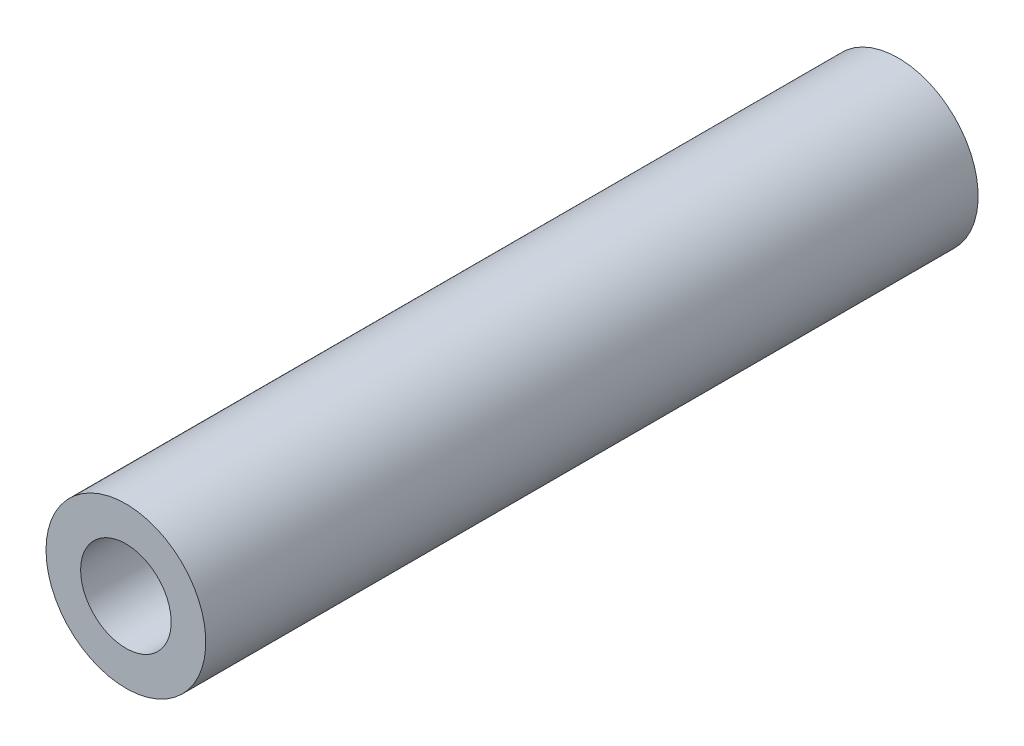
ISO-10303-21;
HEADER;
FILE_DESCRIPTION(('STEP AP214'),'2;1');
FILE_NAME('part.step','',(''),(''),'','','');
FILE_SCHEMA(('AUTOMOTIVE_DESIGN { 1 0 10303 214 1 1 1 1 }'));
ENDSEC;
DATA;
#1=APPLICATION_CONTEXT('core data for automotive mechanical design processes');
#2=APPLICATION_PROTOCOL_DEFINITION('international standard','automotive_design',2000,#1);
#3=PRODUCT_CONTEXT('',#1,'mechanical');
#4=PRODUCT('Part','Part','',(#3));
#5=PRODUCT_RELATED_PRODUCT_CATEGORY('part','',(#4));
#6=PRODUCT_DEFINITION_FORMATION('','',#4);
#7=PRODUCT_DEFINITION_CONTEXT('part definition',#1,'design');
#8=PRODUCT_DEFINITION('design','',#6,#7);
#9=PRODUCT_DEFINITION_SHAPE('','',#8);
#10=(LENGTH_UNIT() NAMED_UNIT(*) SI_UNIT(.MILLI.,.METRE.));
#11=(NAMED_UNIT(*) PLANE_ANGLE_UNIT() SI_UNIT($,.RADIAN.));
#12=(NAMED_UNIT(*) SI_UNIT($,.STERADIAN.) SOLID_ANGLE_UNIT());
#13=UNCERTAINTY_MEASURE_WITH_UNIT(LENGTH_MEASURE(1.E-05),#10,'distance_accuracy_value','');
#14=(GEOMETRIC_REPRESENTATION_CONTEXT(3) GLOBAL_UNCERTAINTY_ASSIGNED_CONTEXT((#13)) GLOBAL_UNIT_ASSIGNED_CONTEXT((#10,
#11,#12)) REPRESENTATION_CONTEXT('',''));
#15=CARTESIAN_POINT('',(0.,0.,0.));
#16=DIRECTION('',(0.,0.,1.));
#17=DIRECTION('',(1.,0.,0.));
#18=AXIS2_PLACEMENT_3D('',#15,#16,#17);
#19=CARTESIAN_POINT('',(0.,0.,29.));
#20=DIRECTION('',(0.,0.,1.));
#21=DIRECTION('',(1.,0.,0.));
#22=AXIS2_PLACEMENT_3D('',#19,#20,#21);
#23=PLANE('',#22);
#24=CARTESIAN_POINT('',(0.,0.,29.));
#25=DIRECTION('',(0.,0.,1.));
#26=DIRECTION('',(1.,0.,0.));
#27=AXIS2_PLACEMENT_3D('',#24,#25,#26);
#28=CIRCLE('',#27,3.);
#29=CARTESIAN_POINT('',(-3.,0.,29.));
#30=VERTEX_POINT('',#29);
#31=EDGE_CURVE('E10',#30,#30,#28,.T.);
#32=ORIENTED_EDGE('',*,*,#31,.T.);
#33=EDGE_LOOP('',(#32));
#34=FACE_BOUND('',#33,.T.);
#35=CARTESIAN_POINT('',(0.,0.,29.));
#36=DIRECTION('',(0.,0.,1.));
#37=DIRECTION('',(1.,0.,0.));
#38=AXIS2_PLACEMENT_3D('',#35,#36,#37);
#39=CIRCLE('',#38,1.7);
#40=CARTESIAN_POINT('',(-1.7,0.,29.));
#41=VERTEX_POINT('',#40);
#42=EDGE_CURVE('E48',#41,#41,#39,.T.);
#43=ORIENTED_EDGE('',*,*,#42,.F.);
#44=EDGE_LOOP('',(#43));
#45=FACE_BOUND('',#44,.T.);
#46=ADVANCED_FACE('F40',(#34,#45),#23,.T.);
#47=CARTESIAN_POINT('',(0.,0.,0.));
#48=DIRECTION('',(0.,0.,1.));
#49=DIRECTION('',(1.,0.,0.));
#50=AXIS2_PLACEMENT_3D('',#47,#48,#49);
#51=PLANE('',#50);
#52=CARTESIAN_POINT('',(0.,0.,0.));
#53=DIRECTION('',(0.,0.,1.));
#54=DIRECTION('',(1.,0.,0.));
#55=AXIS2_PLACEMENT_3D('',#52,#53,#54);
#56=CIRCLE('',#55,3.);
#57=CARTESIAN_POINT('',(-3.,0.,0.));
#58=VERTEX_POINT('',#57);
#59=EDGE_CURVE('E41',#58,#58,#56,.T.);
#60=ORIENTED_EDGE('',*,*,#59,.F.);
#61=EDGE_LOOP('',(#60));
#62=FACE_BOUND('',#61,.T.);
#63=CARTESIAN_POINT('',(0.,0.,0.));
#64=DIRECTION('',(0.,0.,1.));
#65=DIRECTION('',(1.,0.,0.));
#66=AXIS2_PLACEMENT_3D('',#63,#64,#65);
#67=CIRCLE('',#66,1.7);
#68=CARTESIAN_POINT('',(-1.7,0.,0.));
#69=VERTEX_POINT('',#68);
#70=EDGE_CURVE('E49',#69,#69,#67,.T.);
#71=ORIENTED_EDGE('',*,*,#70,.T.);
#72=EDGE_LOOP('',(#71));
#73=FACE_BOUND('',#72,.T.);
#74=ADVANCED_FACE('F58',(#62,#73),#51,.F.);
#75=CARTESIAN_POINT('',(0.,0.,29.));
#76=DIRECTION('',(0.,0.,-1.));
#77=DIRECTION('',(-1.,0.,0.));
#78=AXIS2_PLACEMENT_3D('',#75,#76,#77);
#79=CYLINDRICAL_SURFACE('',#78,3.);
#80=CARTESIAN_POINT('',(-3.,0.,29.));
#81=CARTESIAN_POINT('',(-3.,0.,28.6979166666667));
#82=CARTESIAN_POINT('',(-3.,0.,28.3958333333333));
#83=CARTESIAN_POINT('',(-3.,0.,27.7916666666667));
#84=CARTESIAN_POINT('',(-3.,0.,27.4895833333333));
#85=CARTESIAN_POINT('',(-3.,0.,26.8854166666667));
#86=CARTESIAN_POINT('',(-3.,0.,26.5833333333333));
#87=CARTESIAN_POINT('',(-3.,0.,25.9791666666667));
#88=CARTESIAN_POINT('',(-3.,0.,25.6770833333333));
#89=CARTESIAN_POINT('',(-3.,0.,25.0729166666667));
#90=CARTESIAN_POINT('',(-3.,0.,24.7708333333333));
#91=CARTESIAN_POINT('',(-3.,0.,24.1666666666667));
#92=CARTESIAN_POINT('',(-3.,0.,23.8645833333333));
#93=CARTESIAN_POINT('',(-3.,0.,23.2604166666667));
#94=CARTESIAN_POINT('',(-3.,0.,22.9583333333333));
#95=CARTESIAN_POINT('',(-3.,0.,22.3541666666667));
#96=CARTESIAN_POINT('',(-3.,0.,22.0520833333333));
#97=CARTESIAN_POINT('',(-3.,0.,21.4479166666667));
#98=CARTESIAN_POINT('',(-3.,0.,21.1458333333333));
#99=CARTESIAN_POINT('',(-3.,0.,20.5416666666667));
#100=CARTESIAN_POINT('',(-3.,0.,20.2395833333333));
#101=CARTESIAN_POINT('',(-3.,0.,19.6354166666667));
#102=CARTESIAN_POINT('',(-3.,0.,19.3333333333333));
#103=CARTESIAN_POINT('',(-3.,0.,18.7291666666667));
#104=CARTESIAN_POINT('',(-3.,0.,18.4270833333333));
#105=CARTESIAN_POINT('',(-3.,0.,17.8229166666667));
#106=CARTESIAN_POINT('',(-3.,0.,17.5208333333333));
#107=CARTESIAN_POINT('',(-3.,0.,16.9166666666667));
#108=CARTESIAN_POINT('',(-3.,0.,16.6145833333333));
#109=CARTESIAN_POINT('',(-3.,0.,16.0104166666667));
#110=CARTESIAN_POINT('',(-3.,0.,15.7083333333333));
#111=CARTESIAN_POINT('',(-3.,0.,15.1041666666667));
#112=CARTESIAN_POINT('',(-3.,0.,14.8020833333333));
#113=CARTESIAN_POINT('',(-3.,0.,14.1979166666667));
#114=CARTESIAN_POINT('',(-3.,0.,13.8958333333333));
#115=CARTESIAN_POINT('',(-3.,0.,13.2916666666667));
#116=CARTESIAN_POINT('',(-3.,0.,12.9895833333333));
#117=CARTESIAN_POINT('',(-3.,0.,12.3854166666667));
#118=CARTESIAN_POINT('',(-3.,0.,12.0833333333333));
#119=CARTESIAN_POINT('',(-3.,0.,11.4791666666667));
#120=CARTESIAN_POINT('',(-3.,0.,11.1770833333333));
#121=CARTESIAN_POINT('',(-3.,0.,10.5729166666667));
#122=CARTESIAN_POINT('',(-3.,0.,10.2708333333333));
#123=CARTESIAN_POINT('',(-3.,0.,9.66666666666667));
#124=CARTESIAN_POINT('',(-3.,0.,9.36458333333333));
#125=CARTESIAN_POINT('',(-3.,0.,8.76041666666667));
#126=CARTESIAN_POINT('',(-3.,0.,8.45833333333333));
#127=CARTESIAN_POINT('',(-3.,0.,7.85416666666667));
#128=CARTESIAN_POINT('',(-3.,0.,7.55208333333333));
#129=CARTESIAN_POINT('',(-3.,0.,6.94791666666667));
#130=CARTESIAN_POINT('',(-3.,0.,6.64583333333333));
#131=CARTESIAN_POINT('',(-3.,0.,6.04166666666667));
#132=CARTESIAN_POINT('',(-3.,0.,5.73958333333333));
#133=CARTESIAN_POINT('',(-3.,0.,5.13541666666667));
#134=CARTESIAN_POINT('',(-3.,0.,4.83333333333333));
#135=CARTESIAN_POINT('',(-3.,0.,4.22916666666667));
#136=CARTESIAN_POINT('',(-3.,0.,3.92708333333333));
#137=CARTESIAN_POINT('',(-3.,0.,3.32291666666667));
#138=CARTESIAN_POINT('',(-3.,0.,3.02083333333333));
#139=CARTESIAN_POINT('',(-3.,0.,2.41666666666667));
#140=CARTESIAN_POINT('',(-3.,0.,2.11458333333333));
#141=CARTESIAN_POINT('',(-3.,0.,1.51041666666667));
#142=CARTESIAN_POINT('',(-3.,0.,1.20833333333333));
#143=CARTESIAN_POINT('',(-3.,0.,0.604166666666667));
#144=CARTESIAN_POINT('',(-3.,0.,0.302083333333333));
#145=CARTESIAN_POINT('',(-3.,0.,0.));
#146=B_SPLINE_CURVE_WITH_KNOTS('',3,(#80,#81,#82,#83,#84,#85,#86,#87,#88,#89,#90,#91,#92,#93,
#94,#95,#96,#97,#98,#99,#100,#101,#102,#103,#104,#105,#106,#107,#108,#109,#110,#111,#112,#113,
#114,#115,#116,#117,#118,#119,#120,#121,#122,#123,#124,#125,#126,#127,#128,#129,#130,#131,#132,
#133,#134,#135,#136,#137,#138,#139,#140,#141,#142,#143,#144,#145),.UNSPECIFIED.,.F.,.F.,(4,2,2,
2,2,2,2,2,2,2,2,2,2,2,2,2,2,2,2,2,2,2,2,2,2,2,2,2,2,2,2,2,4),(0.,0.906249999999997,1.8125,
2.71875,3.625,4.53125,5.4375,6.34375,7.25,8.15625,9.0625,9.96875,10.875,11.78125,12.6875,
13.59375,14.5,15.40625,16.3125,17.21875,18.125,19.03125,19.9375,20.84375,21.75,22.65625,23.5625,
24.46875,25.375,26.28125,27.1875,28.09375,29.),.UNSPECIFIED.);
#147=EDGE_CURVE('BSEAM39',#30,#58,#146,.T.);
#148=ORIENTED_EDGE('',*,*,#31,.F.);
#149=ORIENTED_EDGE('',*,*,#59,.T.);
#150=ORIENTED_EDGE('',*,*,#147,.T.);
#151=ORIENTED_EDGE('',*,*,#147,.F.);
#152=EDGE_LOOP('',(#148,#150,#149,#151));
#153=FACE_BOUND('',#152,.T.);
#154=ADVANCED_FACE('F39',(#153),#79,.T.);
#155=CARTESIAN_POINT('',(0.,0.,29.));
#156=DIRECTION('',(0.,0.,-1.));
#157=DIRECTION('',(-1.,0.,0.));
#158=AXIS2_PLACEMENT_3D('',#155,#156,#157);
#159=CYLINDRICAL_SURFACE('',#158,1.7);
#160=CARTESIAN_POINT('',(-1.7,0.,29.));
#161=CARTESIAN_POINT('',(-1.7,0.,28.6979166666667));
#162=CARTESIAN_POINT('',(-1.7,0.,28.3958333333333));
#163=CARTESIAN_POINT('',(-1.7,0.,27.7916666666667));
#164=CARTESIAN_POINT('',(-1.7,0.,27.4895833333333));
#165=CARTESIAN_POINT('',(-1.7,0.,26.8854166666667));
#166=CARTESIAN_POINT('',(-1.7,0.,26.5833333333333));
#167=CARTESIAN_POINT('',(-1.7,0.,25.9791666666667));
#168=CARTESIAN_POINT('',(-1.7,0.,25.6770833333333));
#169=CARTESIAN_POINT('',(-1.7,0.,25.0729166666667));
#170=CARTESIAN_POINT('',(-1.7,0.,24.7708333333333));
#171=CARTESIAN_POINT('',(-1.7,0.,24.1666666666667));
#172=CARTESIAN_POINT('',(-1.7,0.,23.8645833333333));
#173=CARTESIAN_POINT('',(-1.7,0.,23.2604166666667));
#174=CARTESIAN_POINT('',(-1.7,0.,22.9583333333333));
#175=CARTESIAN_POINT('',(-1.7,0.,22.3541666666667));
#176=CARTESIAN_POINT('',(-1.7,0.,22.0520833333333));
#177=CARTESIAN_POINT('',(-1.7,0.,21.4479166666667));
#178=CARTESIAN_POINT('',(-1.7,0.,21.1458333333333));
#179=CARTESIAN_POINT('',(-1.7,0.,20.5416666666667));
#180=CARTESIAN_POINT('',(-1.7,0.,20.2395833333333));
#181=CARTESIAN_POINT('',(-1.7,0.,19.6354166666667));
#182=CARTESIAN_POINT('',(-1.7,0.,19.3333333333333));
#183=CARTESIAN_POINT('',(-1.7,0.,18.7291666666667));
#184=CARTESIAN_POINT('',(-1.7,0.,18.4270833333333));
#185=CARTESIAN_POINT('',(-1.7,0.,17.8229166666667));
#186=CARTESIAN_POINT('',(-1.7,0.,17.5208333333333));
#187=CARTESIAN_POINT('',(-1.7,0.,16.9166666666667));
#188=CARTESIAN_POINT('',(-1.7,0.,16.6145833333333));
#189=CARTESIAN_POINT('',(-1.7,0.,16.0104166666667));
#190=CARTESIAN_POINT('',(-1.7,0.,15.7083333333333));
#191=CARTESIAN_POINT('',(-1.7,0.,15.1041666666667));
#192=CARTESIAN_POINT('',(-1.7,0.,14.8020833333333));
#193=CARTESIAN_POINT('',(-1.7,0.,14.1979166666667));
#194=CARTESIAN_POINT('',(-1.7,0.,13.8958333333333));
#195=CARTESIAN_POINT('',(-1.7,0.,13.2916666666667));
#196=CARTESIAN_POINT('',(-1.7,0.,12.9895833333333));
#197=CARTESIAN_POINT('',(-1.7,0.,12.3854166666667));
#198=CARTESIAN_POINT('',(-1.7,0.,12.0833333333333));
#199=CARTESIAN_POINT('',(-1.7,0.,11.4791666666667));
#200=CARTESIAN_POINT('',(-1.7,0.,11.1770833333333));
#201=CARTESIAN_POINT('',(-1.7,0.,10.5729166666667));
#202=CARTESIAN_POINT('',(-1.7,0.,10.2708333333333));
#203=CARTESIAN_POINT('',(-1.7,0.,9.66666666666667));
#204=CARTESIAN_POINT('',(-1.7,0.,9.36458333333333));
#205=CARTESIAN_POINT('',(-1.7,0.,8.76041666666667));
#206=CARTESIAN_POINT('',(-1.7,0.,8.45833333333333));
#207=CARTESIAN_POINT('',(-1.7,0.,7.85416666666667));
#208=CARTESIAN_POINT('',(-1.7,0.,7.55208333333333));
#209=CARTESIAN_POINT('',(-1.7,0.,6.94791666666667));
#210=CARTESIAN_POINT('',(-1.7,0.,6.64583333333333));
#211=CARTESIAN_POINT('',(-1.7,0.,6.04166666666667));
#212=CARTESIAN_POINT('',(-1.7,0.,5.73958333333333));
#213=CARTESIAN_POINT('',(-1.7,0.,5.13541666666667));
#214=CARTESIAN_POINT('',(-1.7,0.,4.83333333333333));
#215=CARTESIAN_POINT('',(-1.7,0.,4.22916666666667));
#216=CARTESIAN_POINT('',(-1.7,0.,3.92708333333333));
#217=CARTESIAN_POINT('',(-1.7,0.,3.32291666666667));
#218=CARTESIAN_POINT('',(-1.7,0.,3.02083333333333));
#219=CARTESIAN_POINT('',(-1.7,0.,2.41666666666667));
#220=CARTESIAN_POINT('',(-1.7,0.,2.11458333333333));
#221=CARTESIAN_POINT('',(-1.7,0.,1.51041666666667));
#222=CARTESIAN_POINT('',(-1.7,0.,1.20833333333333));
#223=CARTESIAN_POINT('',(-1.7,0.,0.604166666666667));
#224=CARTESIAN_POINT('',(-1.7,0.,0.302083333333333));
#225=CARTESIAN_POINT('',(-1.7,0.,0.));
#226=B_SPLINE_CURVE_WITH_KNOTS('',3,(#160,#161,#162,#163,#164,#165,#166,#167,#168,#169,#170,
#171,#172,#173,#174,#175,#176,#177,#178,#179,#180,#181,#182,#183,#184,#185,#186,#187,#188,#189,
#190,#191,#192,#193,#194,#195,#196,#197,#198,#199,#200,#201,#202,#203,#204,#205,#206,#207,#208,
#209,#210,#211,#212,#213,#214,#215,#216,#217,#218,#219,#220,#221,#222,#223,#224,#225),
.UNSPECIFIED.,.F.,.F.,(4,2,2,2,2,2,2,2,2,2,2,2,2,2,2,2,2,2,2,2,2,2,2,2,2,2,2,2,2,2,2,2,4),(0.,
0.906249999999997,1.8125,2.71875,3.625,4.53125,5.4375,6.34375,7.25,8.15625,9.0625,9.96875,
10.875,11.78125,12.6875,13.59375,14.5,15.40625,16.3125,17.21875,18.125,19.03125,19.9375,
20.84375,21.75,22.65625,23.5625,24.46875,25.375,26.28125,27.1875,28.09375,29.),.UNSPECIFIED.);
#227=EDGE_CURVE('BSEAM57',#41,#69,#226,.T.);
#228=ORIENTED_EDGE('',*,*,#42,.T.);
#229=ORIENTED_EDGE('',*,*,#70,.F.);
#230=ORIENTED_EDGE('',*,*,#227,.T.);
#231=ORIENTED_EDGE('',*,*,#227,.F.);
#232=EDGE_LOOP('',(#228,#230,#229,#231));
#233=FACE_BOUND('',#232,.T.);
#234=ADVANCED_FACE('F57',(#233),#159,.F.);
#235=CLOSED_SHELL('',(#46,#74,#154,#234));
#236=MANIFOLD_SOLID_BREP('B2',#235);
#237=ADVANCED_BREP_SHAPE_REPRESENTATION('',(#18,#236),#14);
#238=SHAPE_DEFINITION_REPRESENTATION(#9,#237);
ENDSEC;
END-ISO-10303-21;
